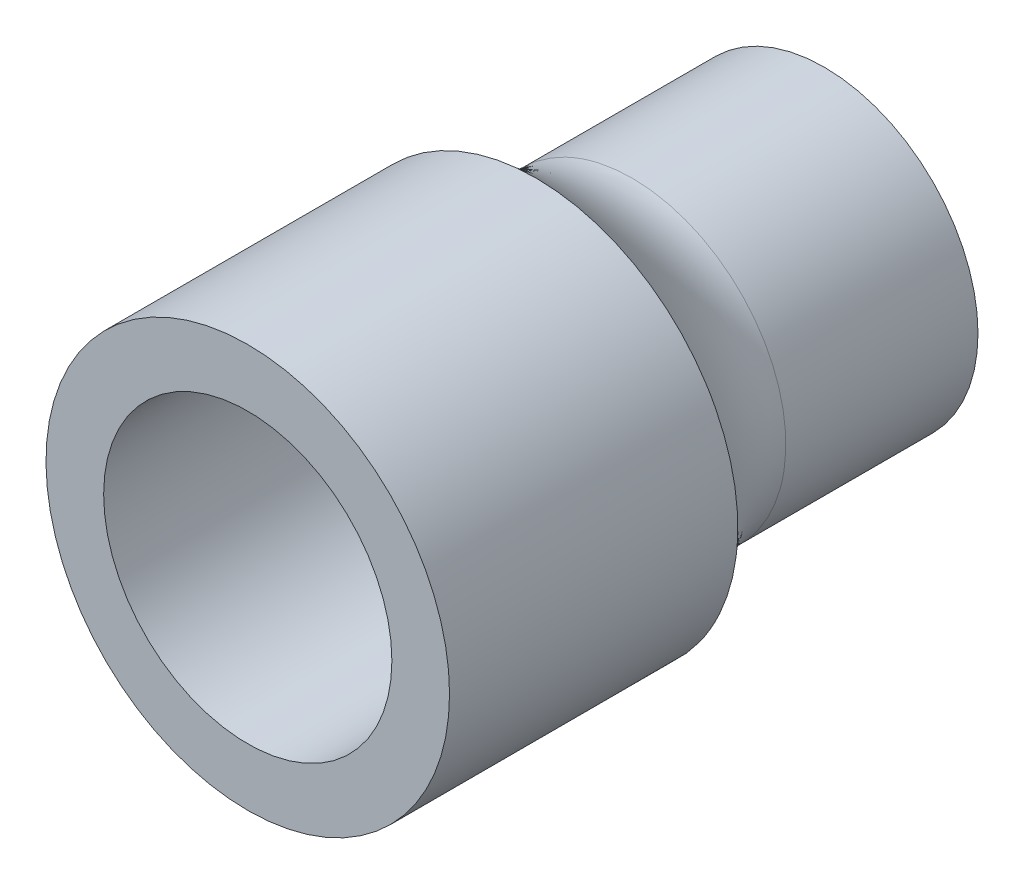
ISO-10303-21;
HEADER;
FILE_DESCRIPTION(('STEP AP214'),'2;1');
FILE_NAME('part.step','',(''),(''),'','','');
FILE_SCHEMA(('AUTOMOTIVE_DESIGN { 1 0 10303 214 1 1 1 1 }'));
ENDSEC;
DATA;
#1=APPLICATION_CONTEXT('core data for automotive mechanical design processes');
#2=APPLICATION_PROTOCOL_DEFINITION('international standard','automotive_design',2000,#1);
#3=PRODUCT_CONTEXT('',#1,'mechanical');
#4=PRODUCT('Part','Part','',(#3));
#5=PRODUCT_RELATED_PRODUCT_CATEGORY('part','',(#4));
#6=PRODUCT_DEFINITION_FORMATION('','',#4);
#7=PRODUCT_DEFINITION_CONTEXT('part definition',#1,'design');
#8=PRODUCT_DEFINITION('design','',#6,#7);
#9=PRODUCT_DEFINITION_SHAPE('','',#8);
#10=(LENGTH_UNIT() NAMED_UNIT(*) SI_UNIT(.MILLI.,.METRE.));
#11=(NAMED_UNIT(*) PLANE_ANGLE_UNIT() SI_UNIT($,.RADIAN.));
#12=(NAMED_UNIT(*) SI_UNIT($,.STERADIAN.) SOLID_ANGLE_UNIT());
#13=UNCERTAINTY_MEASURE_WITH_UNIT(LENGTH_MEASURE(1.E-05),#10,'distance_accuracy_value','');
#14=(GEOMETRIC_REPRESENTATION_CONTEXT(3) GLOBAL_UNCERTAINTY_ASSIGNED_CONTEXT((#13)) GLOBAL_UNIT_ASSIGNED_CONTEXT((#10,
#11,#12)) REPRESENTATION_CONTEXT('',''));
#15=CARTESIAN_POINT('',(0.,0.,0.));
#16=DIRECTION('',(0.,0.,1.));
#17=DIRECTION('',(1.,0.,0.));
#18=AXIS2_PLACEMENT_3D('',#15,#16,#17);
#19=CARTESIAN_POINT('',(0.,0.,0.));
#20=DIRECTION('',(0.,0.,1.));
#21=DIRECTION('',(1.,0.,0.));
#22=AXIS2_PLACEMENT_3D('',#19,#20,#21);
#23=PLANE('',#22);
#24=CARTESIAN_POINT('',(0.,0.,0.));
#25=DIRECTION('',(0.,0.,1.));
#26=DIRECTION('',(1.,0.,0.));
#27=AXIS2_PLACEMENT_3D('',#24,#25,#26);
#28=CIRCLE('',#27,8.);
#29=CARTESIAN_POINT('',(8.,0.,0.));
#30=VERTEX_POINT('',#29);
#31=EDGE_CURVE('E55',#30,#30,#28,.T.);
#32=ORIENTED_EDGE('',*,*,#31,.F.);
#33=EDGE_LOOP('',(#32));
#34=FACE_BOUND('',#33,.T.);
#35=CARTESIAN_POINT('',(0.,0.,0.));
#36=DIRECTION('',(0.,0.,1.));
#37=DIRECTION('',(1.,0.,0.));
#38=AXIS2_PLACEMENT_3D('',#35,#36,#37);
#39=CIRCLE('',#38,6.);
#40=CARTESIAN_POINT('',(6.,0.,0.));
#41=VERTEX_POINT('',#40);
#42=EDGE_CURVE('E61',#41,#41,#39,.T.);
#43=ORIENTED_EDGE('',*,*,#42,.T.);
#44=EDGE_LOOP('',(#43));
#45=FACE_BOUND('',#44,.T.);
#46=ADVANCED_FACE('F45',(#34,#45),#23,.F.);
#47=CARTESIAN_POINT('',(0.,0.,10.));
#48=DIRECTION('',(0.,0.,-1.));
#49=DIRECTION('',(-1.,0.,0.));
#50=AXIS2_PLACEMENT_3D('',#47,#48,#49);
#51=CYLINDRICAL_SURFACE('',#50,8.);
#52=CARTESIAN_POINT('',(0.,0.,10.));
#53=DIRECTION('',(0.,0.,-1.));
#54=DIRECTION('',(-1.,0.,0.));
#55=AXIS2_PLACEMENT_3D('',#52,#53,#54);
#56=CIRCLE('',#55,8.);
#57=CARTESIAN_POINT('',(-4.24834953046645,6.778755510194,10.));
#58=VERTEX_POINT('',#57);
#59=EDGE_CURVE('E11',#58,#58,#56,.F.);
#60=ORIENTED_EDGE('',*,*,#59,.F.);
#61=EDGE_LOOP('',(#60));
#62=FACE_BOUND('',#61,.T.);
#63=ORIENTED_EDGE('',*,*,#31,.T.);
#64=EDGE_LOOP('',(#63));
#65=FACE_BOUND('',#64,.T.);
#66=ADVANCED_FACE('F47',(#62,#65),#51,.T.);
#67=CARTESIAN_POINT('',(0.,0.,10.));
#68=DIRECTION('',(0.,0.,-1.));
#69=DIRECTION('',(-1.,0.,0.));
#70=AXIS2_PLACEMENT_3D('',#67,#68,#69);
#71=CYLINDRICAL_SURFACE('',#70,6.);
#72=CARTESIAN_POINT('',(0.,0.,10.));
#73=DIRECTION('',(0.,0.,-1.));
#74=DIRECTION('',(-1.,0.,0.));
#75=AXIS2_PLACEMENT_3D('',#72,#73,#74);
#76=CIRCLE('',#75,6.);
#77=CARTESIAN_POINT('',(-6.,0.,10.));
#78=VERTEX_POINT('',#77);
#79=EDGE_CURVE('E49',#78,#78,#76,.T.);
#80=ORIENTED_EDGE('',*,*,#79,.F.);
#81=EDGE_LOOP('',(#80));
#82=FACE_BOUND('',#81,.T.);
#83=ORIENTED_EDGE('',*,*,#42,.F.);
#84=EDGE_LOOP('',(#83));
#85=FACE_BOUND('',#84,.T.);
#86=ADVANCED_FACE('F98',(#82,#85),#71,.F.);
#87=CARTESIAN_POINT('',(-10.0922369287829,2.89771526781184,15.));
#88=CARTESIAN_POINT('',(-4.24834953046645,6.778755510194,10.));
#89=CARTESIAN_POINT('',(-4.29680639315927,23.0821891253777,15.));
#90=CARTESIAN_POINT('',(9.30916148992156,15.2754545711269,10.));
#91=CARTESIAN_POINT('',(15.8876674644066,17.286758589754,15.));
#92=CARTESIAN_POINT('',(17.8058605508544,1.71794355073888,10.));
#93=CARTESIAN_POINT('',(10.0922369287829,-2.89771526781184,15.));
#94=CARTESIAN_POINT('',(4.24834953046644,-6.778755510194,10.));
#95=CARTESIAN_POINT('',(4.29680639315927,-23.0821891253777,15.));
#96=CARTESIAN_POINT('',(-9.30916148992156,-15.2754545711269,10.));
#97=CARTESIAN_POINT('',(-15.8876674644066,-17.286758589754,15.));
#98=CARTESIAN_POINT('',(-17.8058605508544,-1.71794355073889,10.));
#99=CARTESIAN_POINT('',(-10.0922369287829,2.89771526781184,15.));
#100=CARTESIAN_POINT('',(-4.24834953046645,6.778755510194,10.));
#101=(BOUNDED_SURFACE() B_SPLINE_SURFACE(3,1,((#87,#88),(#89,#90),(#91,#92),(#93,#94),(#95,#96),
(#97,#98),(#99,#100)),.UNSPECIFIED.,.T.,.F.,.F.) B_SPLINE_SURFACE_WITH_KNOTS((4,3,4),(2,2),(0.,
0.5,1.),(0.,1.),.UNSPECIFIED.) GEOMETRIC_REPRESENTATION_ITEM() RATIONAL_B_SPLINE_SURFACE(((1.,
1.),(0.333333333333333,0.333333333333333),(0.333333333333333,0.333333333333333),(1.,1.),
(0.333333333333334,0.333333333333333),(0.333333333333334,0.333333333333333),(1.,1.))) REPRESENTATION_ITEM('') SURFACE());
#102=CARTESIAN_POINT('',(0.,0.,15.));
#103=DIRECTION('',(0.,0.,1.));
#104=DIRECTION('',(1.,0.,0.));
#105=AXIS2_PLACEMENT_3D('',#102,#103,#104);
#106=CIRCLE('',#105,10.5);
#107=CARTESIAN_POINT('',(-10.0922369287829,2.89771526781184,15.));
#108=VERTEX_POINT('',#107);
#109=EDGE_CURVE('E71',#108,#108,#106,.T.);
#110=CARTESIAN_POINT('',(-10.0922369287829,2.89771526781184,15.));
#111=CARTESIAN_POINT('',(-10.0313631017171,2.93814277033665,14.9479166666667));
#112=CARTESIAN_POINT('',(-9.97048927465135,2.97857027286146,14.8958333333333));
#113=CARTESIAN_POINT('',(-9.84874162051976,3.05942527791109,14.7916666666667));
#114=CARTESIAN_POINT('',(-9.78786779345396,3.09985278043591,14.7395833333333));
#115=CARTESIAN_POINT('',(-9.66612013932236,3.18070778548553,14.6354166666667));
#116=CARTESIAN_POINT('',(-9.60524631225657,3.22113528801035,14.5833333333333));
#117=CARTESIAN_POINT('',(-9.48349865812497,3.30199029305998,14.4791666666667));
#118=CARTESIAN_POINT('',(-9.42262483105918,3.34241779558479,14.4270833333333));
#119=CARTESIAN_POINT('',(-9.30087717692759,3.42327280063442,14.3229166666667));
#120=CARTESIAN_POINT('',(-9.24000334986179,3.46370030315923,14.2708333333333));
#121=CARTESIAN_POINT('',(-9.11825569573019,3.54455530820886,14.1666666666667));
#122=CARTESIAN_POINT('',(-9.0573818686644,3.58498281073368,14.1145833333333));
#123=CARTESIAN_POINT('',(-8.9356342145328,3.66583781578331,14.0104166666667));
#124=CARTESIAN_POINT('',(-8.874760387467,3.70626531830812,13.9583333333333));
#125=CARTESIAN_POINT('',(-8.75301273333541,3.78712032335775,13.8541666666667));
#126=CARTESIAN_POINT('',(-8.69213890626962,3.82754782588256,13.8020833333333));
#127=CARTESIAN_POINT('',(-8.57039125213802,3.90840283093219,13.6979166666667));
#128=CARTESIAN_POINT('',(-8.50951742507223,3.94883033345701,13.6458333333333));
#129=CARTESIAN_POINT('',(-8.38776977094063,4.02968533850663,13.5416666666667));
#130=CARTESIAN_POINT('',(-8.32689594387483,4.07011284103145,13.4895833333333));
#131=CARTESIAN_POINT('',(-8.20514828974324,4.15096784608108,13.3854166666667));
#132=CARTESIAN_POINT('',(-8.14427446267744,4.19139534860589,13.3333333333333));
#133=CARTESIAN_POINT('',(-8.02252680854585,4.27225035365552,13.2291666666667));
#134=CARTESIAN_POINT('',(-7.96165298148005,4.31267785618033,13.1770833333333));
#135=CARTESIAN_POINT('',(-7.83990532734846,4.39353286122996,13.0729166666667));
#136=CARTESIAN_POINT('',(-7.77903150028266,4.43396036375478,13.0208333333333));
#137=CARTESIAN_POINT('',(-7.65728384615107,4.5148153688044,12.9166666666667));
#138=CARTESIAN_POINT('',(-7.59641001908527,4.55524287132922,12.8645833333333));
#139=CARTESIAN_POINT('',(-7.47466236495368,4.63609787637885,12.7604166666667));
#140=CARTESIAN_POINT('',(-7.41378853788788,4.67652537890366,12.7083333333333));
#141=CARTESIAN_POINT('',(-7.29204088375629,4.75738038395329,12.6041666666667));
#142=CARTESIAN_POINT('',(-7.23116705669049,4.7978078864781,12.5520833333333));
#143=CARTESIAN_POINT('',(-7.1094194025589,4.87866289152773,12.4479166666667));
#144=CARTESIAN_POINT('',(-7.0485455754931,4.91909039405255,12.3958333333333));
#145=CARTESIAN_POINT('',(-6.92679792136151,4.99994539910218,12.2916666666667));
#146=CARTESIAN_POINT('',(-6.86592409429571,5.04037290162699,12.2395833333333));
#147=CARTESIAN_POINT('',(-6.74417644016412,5.12122790667662,12.1354166666667));
#148=CARTESIAN_POINT('',(-6.68330261309832,5.16165540920143,12.0833333333333));
#149=CARTESIAN_POINT('',(-6.56155495896673,5.24251041425106,11.9791666666667));
#150=CARTESIAN_POINT('',(-6.50068113190093,5.28293791677587,11.9270833333333));
#151=CARTESIAN_POINT('',(-6.37893347776934,5.3637929218255,11.8229166666667));
#152=CARTESIAN_POINT('',(-6.31805965070354,5.40422042435032,11.7708333333333));
#153=CARTESIAN_POINT('',(-6.19631199657195,5.48507542939995,11.6666666666667));
#154=CARTESIAN_POINT('',(-6.13543816950615,5.52550293192476,11.6145833333333));
#155=CARTESIAN_POINT('',(-6.01369051537455,5.60635793697439,11.5104166666667));
#156=CARTESIAN_POINT('',(-5.95281668830876,5.6467854394992,11.4583333333333));
#157=CARTESIAN_POINT('',(-5.83106903417716,5.72764044454883,11.3541666666667));
#158=CARTESIAN_POINT('',(-5.77019520711137,5.76806794707365,11.3020833333333));
#159=CARTESIAN_POINT('',(-5.64844755297977,5.84892295212327,11.1979166666667));
#160=CARTESIAN_POINT('',(-5.58757372591398,5.88935045464809,11.1458333333333));
#161=CARTESIAN_POINT('',(-5.46582607178238,5.97020545969772,11.0416666666667));
#162=CARTESIAN_POINT('',(-5.40495224471659,6.01063296222253,10.9895833333333));
#163=CARTESIAN_POINT('',(-5.28320459058499,6.09148796727216,10.8854166666667));
#164=CARTESIAN_POINT('',(-5.2223307635192,6.13191546979697,10.8333333333333));
#165=CARTESIAN_POINT('',(-5.1005831093876,6.2127704748466,10.7291666666667));
#166=CARTESIAN_POINT('',(-5.0397092823218,6.25319797737142,10.6770833333333));
#167=CARTESIAN_POINT('',(-4.91796162819021,6.33405298242105,10.5729166666667));
#168=CARTESIAN_POINT('',(-4.85708780112441,6.37448048494586,10.5208333333333));
#169=CARTESIAN_POINT('',(-4.73534014699282,6.45533548999549,10.4166666666667));
#170=CARTESIAN_POINT('',(-4.67446631992702,6.4957629925203,10.3645833333333));
#171=CARTESIAN_POINT('',(-4.55271866579543,6.57661799756993,10.2604166666667));
#172=CARTESIAN_POINT('',(-4.49184483872963,6.61704550009474,10.2083333333333));
#173=CARTESIAN_POINT('',(-4.37009718459804,6.69790050514437,10.1041666666667));
#174=CARTESIAN_POINT('',(-4.30922335753224,6.73832800766919,10.0520833333333));
#175=CARTESIAN_POINT('',(-4.24834953046645,6.778755510194,10.));
#176=B_SPLINE_CURVE_WITH_KNOTS('',3,(#110,#111,#112,#113,#114,#115,#116,#117,#118,#119,#120,
#121,#122,#123,#124,#125,#126,#127,#128,#129,#130,#131,#132,#133,#134,#135,#136,#137,#138,#139,
#140,#141,#142,#143,#144,#145,#146,#147,#148,#149,#150,#151,#152,#153,#154,#155,#156,#157,#158,
#159,#160,#161,#162,#163,#164,#165,#166,#167,#168,#169,#170,#171,#172,#173,#174,#175),
.UNSPECIFIED.,.F.,.F.,(4,2,2,2,2,2,2,2,2,2,2,2,2,2,2,2,2,2,2,2,2,2,2,2,2,2,2,2,2,2,2,2,4),(0.,
0.269210167969699,0.538420335939399,0.807630503909098,1.0768406718788,1.3460508398485,
1.61526100781819,1.88447117578789,2.15368134375759,2.42289151172729,2.69210167969699,
2.96131184766669,3.23052201563639,3.49973218360609,3.76894235157579,4.03815251954549,
4.30736268751519,4.57657285548489,4.84578302345458,5.11499319142428,5.38420335939398,
5.65341352736368,5.92262369533338,6.19183386330308,6.46104403127278,6.73025419924248,
6.99946436721218,7.26867453518188,7.53788470315158,7.80709487112128,8.07630503909098,
8.34551520706067,8.61472537503037),.UNSPECIFIED.);
#177=EDGE_CURVE('BSEAM92',#108,#58,#176,.T.);
#178=ORIENTED_EDGE('',*,*,#109,.F.);
#179=ORIENTED_EDGE('',*,*,#59,.T.);
#180=ORIENTED_EDGE('',*,*,#177,.T.);
#181=ORIENTED_EDGE('',*,*,#177,.F.);
#182=EDGE_LOOP('',(#178,#180,#179,#181));
#183=FACE_BOUND('',#182,.T.);
#184=ADVANCED_FACE('F92',(#183),#101,.T.);
#185=CARTESIAN_POINT('',(0.,0.,30.));
#186=DIRECTION('',(0.,0.,1.));
#187=DIRECTION('',(1.,0.,0.));
#188=AXIS2_PLACEMENT_3D('',#185,#186,#187);
#189=PLANE('',#188);
#190=CARTESIAN_POINT('',(0.,0.,30.));
#191=DIRECTION('',(0.,0.,1.));
#192=DIRECTION('',(1.,0.,0.));
#193=AXIS2_PLACEMENT_3D('',#190,#191,#192);
#194=CIRCLE('',#193,10.5);
#195=CARTESIAN_POINT('',(10.5,0.,30.));
#196=VERTEX_POINT('',#195);
#197=EDGE_CURVE('E122',#196,#196,#194,.T.);
#198=ORIENTED_EDGE('',*,*,#197,.T.);
#199=EDGE_LOOP('',(#198));
#200=FACE_BOUND('',#199,.T.);
#201=CARTESIAN_POINT('',(0.,0.,30.));
#202=DIRECTION('',(0.,0.,1.));
#203=DIRECTION('',(1.,0.,0.));
#204=AXIS2_PLACEMENT_3D('',#201,#202,#203);
#205=CIRCLE('',#204,7.5);
#206=CARTESIAN_POINT('',(7.5,0.,30.));
#207=VERTEX_POINT('',#206);
#208=EDGE_CURVE('E125',#207,#207,#205,.T.);
#209=ORIENTED_EDGE('',*,*,#208,.F.);
#210=EDGE_LOOP('',(#209));
#211=FACE_BOUND('',#210,.T.);
#212=ADVANCED_FACE('F89',(#200,#211),#189,.T.);
#213=CARTESIAN_POINT('',(0.,0.,30.));
#214=DIRECTION('',(0.,0.,-1.));
#215=DIRECTION('',(-1.,0.,0.));
#216=AXIS2_PLACEMENT_3D('',#213,#214,#215);
#217=CYLINDRICAL_SURFACE('',#216,10.5);
#218=ORIENTED_EDGE('',*,*,#197,.F.);
#219=EDGE_LOOP('',(#218));
#220=FACE_BOUND('',#219,.T.);
#221=ORIENTED_EDGE('',*,*,#109,.T.);
#222=EDGE_LOOP('',(#221));
#223=FACE_BOUND('',#222,.T.);
#224=ADVANCED_FACE('F78',(#220,#223),#217,.T.);
#225=CARTESIAN_POINT('',(0.,0.,30.));
#226=DIRECTION('',(0.,0.,-1.));
#227=DIRECTION('',(-1.,0.,0.));
#228=AXIS2_PLACEMENT_3D('',#225,#226,#227);
#229=CYLINDRICAL_SURFACE('',#228,7.5);
#230=ORIENTED_EDGE('',*,*,#208,.T.);
#231=EDGE_LOOP('',(#230));
#232=FACE_BOUND('',#231,.T.);
#233=CARTESIAN_POINT('',(0.,0.,15.));
#234=DIRECTION('',(0.,0.,1.));
#235=DIRECTION('',(1.,0.,0.));
#236=AXIS2_PLACEMENT_3D('',#233,#234,#235);
#237=CIRCLE('',#236,7.5);
#238=CARTESIAN_POINT('',(7.5,0.,15.));
#239=VERTEX_POINT('',#238);
#240=EDGE_CURVE('E140',#239,#239,#237,.T.);
#241=ORIENTED_EDGE('',*,*,#240,.F.);
#242=EDGE_LOOP('',(#241));
#243=FACE_BOUND('',#242,.T.);
#244=ADVANCED_FACE('F88',(#232,#243),#229,.F.);
#245=CARTESIAN_POINT('',(0.,0.,10.));
#246=DIRECTION('',(0.,0.,1.));
#247=DIRECTION('',(1.,0.,0.));
#248=AXIS2_PLACEMENT_3D('',#245,#246,#247);
#249=CONICAL_SURFACE('',#248,6.,0.291456794477867);
#250=ORIENTED_EDGE('',*,*,#240,.T.);
#251=EDGE_LOOP('',(#250));
#252=FACE_BOUND('',#251,.T.);
#253=ORIENTED_EDGE('',*,*,#79,.T.);
#254=EDGE_LOOP('',(#253));
#255=FACE_BOUND('',#254,.T.);
#256=ADVANCED_FACE('F160',(#252,#255),#249,.F.);
#257=CLOSED_SHELL('',(#46,#66,#86,#184,#212,#224,#244,#256));
#258=MANIFOLD_SOLID_BREP('B2',#257);
#259=ADVANCED_BREP_SHAPE_REPRESENTATION('',(#18,#258),#14);
#260=SHAPE_DEFINITION_REPRESENTATION(#9,#259);
ENDSEC;
END-ISO-10303-21;
